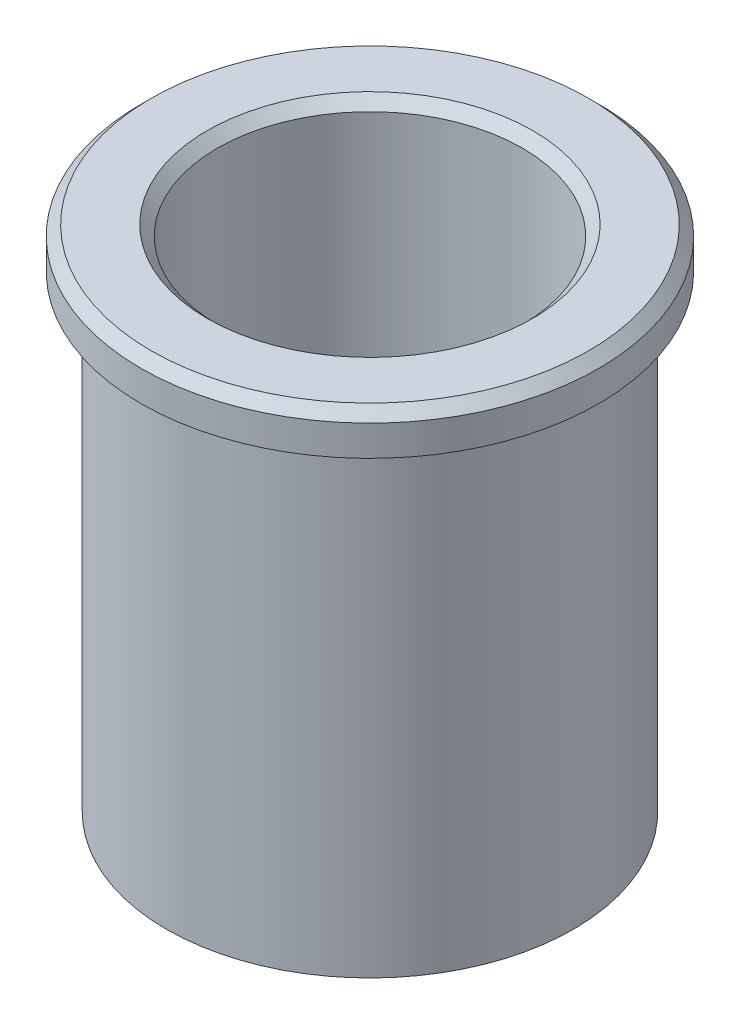
ISO-10303-21;
HEADER;
FILE_DESCRIPTION(('STEP AP214'),'2;1');
FILE_NAME('part.step','',(''),(''),'','','');
FILE_SCHEMA(('AUTOMOTIVE_DESIGN { 1 0 10303 214 1 1 1 1 }'));
ENDSEC;
DATA;
#1=APPLICATION_CONTEXT('core data for automotive mechanical design processes');
#2=APPLICATION_PROTOCOL_DEFINITION('international standard','automotive_design',2000,#1);
#3=PRODUCT_CONTEXT('',#1,'mechanical');
#4=PRODUCT('Part','Part','',(#3));
#5=PRODUCT_RELATED_PRODUCT_CATEGORY('part','',(#4));
#6=PRODUCT_DEFINITION_FORMATION('','',#4);
#7=PRODUCT_DEFINITION_CONTEXT('part definition',#1,'design');
#8=PRODUCT_DEFINITION('design','',#6,#7);
#9=PRODUCT_DEFINITION_SHAPE('','',#8);
#10=(LENGTH_UNIT() NAMED_UNIT(*) SI_UNIT(.MILLI.,.METRE.));
#11=(NAMED_UNIT(*) PLANE_ANGLE_UNIT() SI_UNIT($,.RADIAN.));
#12=(NAMED_UNIT(*) SI_UNIT($,.STERADIAN.) SOLID_ANGLE_UNIT());
#13=UNCERTAINTY_MEASURE_WITH_UNIT(LENGTH_MEASURE(1.E-05),#10,'distance_accuracy_value','');
#14=(GEOMETRIC_REPRESENTATION_CONTEXT(3) GLOBAL_UNCERTAINTY_ASSIGNED_CONTEXT((#13)) GLOBAL_UNIT_ASSIGNED_CONTEXT((#10,
#11,#12)) REPRESENTATION_CONTEXT('',''));
#15=CARTESIAN_POINT('',(0.,0.,0.));
#16=DIRECTION('',(0.,0.,1.));
#17=DIRECTION('',(1.,0.,0.));
#18=AXIS2_PLACEMENT_3D('',#15,#16,#17);
#19=CARTESIAN_POINT('',(22.5,-4.,0.));
#20=DIRECTION('',(0.,1.,0.));
#21=DIRECTION('',(0.,0.,1.));
#22=AXIS2_PLACEMENT_3D('',#19,#20,#21);
#23=PLANE('',#22);
#24=CARTESIAN_POINT('',(0.,-4.,0.));
#25=DIRECTION('',(0.,1.,0.));
#26=DIRECTION('',(0.,0.,1.));
#27=AXIS2_PLACEMENT_3D('',#24,#25,#26);
#28=CIRCLE('',#27,22.5);
#29=CARTESIAN_POINT('',(0.,-4.,22.5));
#30=VERTEX_POINT('',#29);
#31=EDGE_CURVE('E78',#30,#30,#28,.T.);
#32=ORIENTED_EDGE('',*,*,#31,.F.);
#33=EDGE_LOOP('',(#32));
#34=FACE_BOUND('',#33,.T.);
#35=CARTESIAN_POINT('',(0.,-4.,0.));
#36=DIRECTION('',(0.,1.,0.));
#37=DIRECTION('',(0.,0.,1.));
#38=AXIS2_PLACEMENT_3D('',#35,#36,#37);
#39=CIRCLE('',#38,20.);
#40=CARTESIAN_POINT('',(0.,-4.,20.));
#41=VERTEX_POINT('',#40);
#42=EDGE_CURVE('E10',#41,#41,#39,.T.);
#43=ORIENTED_EDGE('',*,*,#42,.T.);
#44=EDGE_LOOP('',(#43));
#45=FACE_BOUND('',#44,.T.);
#46=ADVANCED_FACE('F39',(#34,#45),#23,.F.);
#47=CARTESIAN_POINT('',(0.,22.6164383561644,0.));
#48=DIRECTION('',(0.,1.,0.));
#49=DIRECTION('',(0.,0.,1.));
#50=AXIS2_PLACEMENT_3D('',#47,#48,#49);
#51=CYLINDRICAL_SURFACE('',#50,20.);
#52=ORIENTED_EDGE('',*,*,#42,.F.);
#53=EDGE_LOOP('',(#52));
#54=FACE_BOUND('',#53,.T.);
#55=CARTESIAN_POINT('',(0.,-50.,0.));
#56=DIRECTION('',(0.,1.,0.));
#57=DIRECTION('',(0.,0.,1.));
#58=AXIS2_PLACEMENT_3D('',#55,#56,#57);
#59=CIRCLE('',#58,20.);
#60=CARTESIAN_POINT('',(0.,-50.,20.));
#61=VERTEX_POINT('',#60);
#62=EDGE_CURVE('E46',#61,#61,#59,.T.);
#63=ORIENTED_EDGE('',*,*,#62,.T.);
#64=EDGE_LOOP('',(#63));
#65=FACE_BOUND('',#64,.T.);
#66=ADVANCED_FACE('F86',(#54,#65),#51,.T.);
#67=CARTESIAN_POINT('',(20.,-50.,0.));
#68=DIRECTION('',(0.,1.,0.));
#69=DIRECTION('',(0.,0.,1.));
#70=AXIS2_PLACEMENT_3D('',#67,#68,#69);
#71=PLANE('',#70);
#72=ORIENTED_EDGE('',*,*,#62,.F.);
#73=EDGE_LOOP('',(#72));
#74=FACE_BOUND('',#73,.T.);
#75=CARTESIAN_POINT('',(0.,-50.,0.));
#76=DIRECTION('',(0.,1.,0.));
#77=DIRECTION('',(0.,0.,1.));
#78=AXIS2_PLACEMENT_3D('',#75,#76,#77);
#79=CIRCLE('',#78,16.);
#80=CARTESIAN_POINT('',(0.,-50.,16.));
#81=VERTEX_POINT('',#80);
#82=EDGE_CURVE('E51',#81,#81,#79,.T.);
#83=ORIENTED_EDGE('',*,*,#82,.T.);
#84=EDGE_LOOP('',(#83));
#85=FACE_BOUND('',#84,.T.);
#86=ADVANCED_FACE('F90',(#74,#85),#71,.F.);
#87=CARTESIAN_POINT('',(0.,-49.,0.));
#88=DIRECTION('',(0.,-1.,0.));
#89=DIRECTION('',(0.,0.,-1.));
#90=AXIS2_PLACEMENT_3D('',#87,#88,#89);
#91=CONICAL_SURFACE('',#90,15.,0.785398163397448);
#92=ORIENTED_EDGE('',*,*,#82,.F.);
#93=EDGE_LOOP('',(#92));
#94=FACE_BOUND('',#93,.T.);
#95=CARTESIAN_POINT('',(0.,-49.,0.));
#96=DIRECTION('',(0.,1.,0.));
#97=DIRECTION('',(0.,0.,1.));
#98=AXIS2_PLACEMENT_3D('',#95,#96,#97);
#99=CIRCLE('',#98,15.);
#100=CARTESIAN_POINT('',(0.,-49.,15.));
#101=VERTEX_POINT('',#100);
#102=EDGE_CURVE('E57',#101,#101,#99,.T.);
#103=ORIENTED_EDGE('',*,*,#102,.T.);
#104=EDGE_LOOP('',(#103));
#105=FACE_BOUND('',#104,.T.);
#106=ADVANCED_FACE('F95',(#94,#105),#91,.F.);
#107=CARTESIAN_POINT('',(0.,22.6164383561644,0.));
#108=DIRECTION('',(0.,1.,0.));
#109=DIRECTION('',(0.,0.,1.));
#110=AXIS2_PLACEMENT_3D('',#107,#108,#109);
#111=CYLINDRICAL_SURFACE('',#110,15.);
#112=ORIENTED_EDGE('',*,*,#102,.F.);
#113=EDGE_LOOP('',(#112));
#114=FACE_BOUND('',#113,.T.);
#115=CARTESIAN_POINT('',(0.,-1.,0.));
#116=DIRECTION('',(0.,1.,0.));
#117=DIRECTION('',(0.,0.,1.));
#118=AXIS2_PLACEMENT_3D('',#115,#116,#117);
#119=CIRCLE('',#118,15.);
#120=CARTESIAN_POINT('',(0.,-1.,15.));
#121=VERTEX_POINT('',#120);
#122=EDGE_CURVE('E63',#121,#121,#119,.T.);
#123=ORIENTED_EDGE('',*,*,#122,.T.);
#124=EDGE_LOOP('',(#123));
#125=FACE_BOUND('',#124,.T.);
#126=ADVANCED_FACE('F101',(#114,#125),#111,.F.);
#127=CARTESIAN_POINT('',(0.,0.,0.));
#128=DIRECTION('',(0.,1.,0.));
#129=DIRECTION('',(0.,0.,1.));
#130=AXIS2_PLACEMENT_3D('',#127,#128,#129);
#131=CONICAL_SURFACE('',#130,16.,0.785398163397448);
#132=ORIENTED_EDGE('',*,*,#122,.F.);
#133=EDGE_LOOP('',(#132));
#134=FACE_BOUND('',#133,.T.);
#135=CARTESIAN_POINT('',(0.,0.,0.));
#136=DIRECTION('',(0.,1.,0.));
#137=DIRECTION('',(0.,0.,1.));
#138=AXIS2_PLACEMENT_3D('',#135,#136,#137);
#139=CIRCLE('',#138,16.);
#140=CARTESIAN_POINT('',(0.,0.,16.));
#141=VERTEX_POINT('',#140);
#142=EDGE_CURVE('E67',#141,#141,#139,.T.);
#143=ORIENTED_EDGE('',*,*,#142,.T.);
#144=EDGE_LOOP('',(#143));
#145=FACE_BOUND('',#144,.T.);
#146=ADVANCED_FACE('F105',(#134,#145),#131,.F.);
#147=CARTESIAN_POINT('',(16.,0.,0.));
#148=DIRECTION('',(0.,-1.,0.));
#149=DIRECTION('',(0.,0.,-1.));
#150=AXIS2_PLACEMENT_3D('',#147,#148,#149);
#151=PLANE('',#150);
#152=ORIENTED_EDGE('',*,*,#142,.F.);
#153=EDGE_LOOP('',(#152));
#154=FACE_BOUND('',#153,.T.);
#155=CARTESIAN_POINT('',(0.,0.,0.));
#156=DIRECTION('',(0.,1.,0.));
#157=DIRECTION('',(0.,0.,1.));
#158=AXIS2_PLACEMENT_3D('',#155,#156,#157);
#159=CIRCLE('',#158,21.5);
#160=CARTESIAN_POINT('',(0.,0.,21.5));
#161=VERTEX_POINT('',#160);
#162=EDGE_CURVE('E70',#161,#161,#159,.T.);
#163=ORIENTED_EDGE('',*,*,#162,.T.);
#164=EDGE_LOOP('',(#163));
#165=FACE_BOUND('',#164,.T.);
#166=ADVANCED_FACE('F109',(#154,#165),#151,.F.);
#167=CARTESIAN_POINT('',(0.,-1.,0.));
#168=DIRECTION('',(0.,-1.,0.));
#169=DIRECTION('',(0.,0.,-1.));
#170=AXIS2_PLACEMENT_3D('',#167,#168,#169);
#171=CONICAL_SURFACE('',#170,22.5,0.785398163397448);
#172=ORIENTED_EDGE('',*,*,#162,.F.);
#173=EDGE_LOOP('',(#172));
#174=FACE_BOUND('',#173,.T.);
#175=CARTESIAN_POINT('',(0.,-1.,0.));
#176=DIRECTION('',(0.,1.,0.));
#177=DIRECTION('',(0.,0.,1.));
#178=AXIS2_PLACEMENT_3D('',#175,#176,#177);
#179=CIRCLE('',#178,22.5);
#180=CARTESIAN_POINT('',(0.,-1.,22.5));
#181=VERTEX_POINT('',#180);
#182=EDGE_CURVE('E74',#181,#181,#179,.T.);
#183=ORIENTED_EDGE('',*,*,#182,.T.);
#184=EDGE_LOOP('',(#183));
#185=FACE_BOUND('',#184,.T.);
#186=ADVANCED_FACE('F113',(#174,#185),#171,.T.);
#187=CARTESIAN_POINT('',(0.,22.6164383561644,0.));
#188=DIRECTION('',(0.,1.,0.));
#189=DIRECTION('',(0.,0.,1.));
#190=AXIS2_PLACEMENT_3D('',#187,#188,#189);
#191=CYLINDRICAL_SURFACE('',#190,22.5);
#192=ORIENTED_EDGE('',*,*,#182,.F.);
#193=EDGE_LOOP('',(#192));
#194=FACE_BOUND('',#193,.T.);
#195=ORIENTED_EDGE('',*,*,#31,.T.);
#196=EDGE_LOOP('',(#195));
#197=FACE_BOUND('',#196,.T.);
#198=ADVANCED_FACE('F83',(#194,#197),#191,.T.);
#199=CLOSED_SHELL('',(#46,#66,#86,#106,#126,#146,#166,#186,#198));
#200=MANIFOLD_SOLID_BREP('B2',#199);
#201=ADVANCED_BREP_SHAPE_REPRESENTATION('',(#18,#200),#14);
#202=SHAPE_DEFINITION_REPRESENTATION(#9,#201);
ENDSEC;
END-ISO-10303-21;
